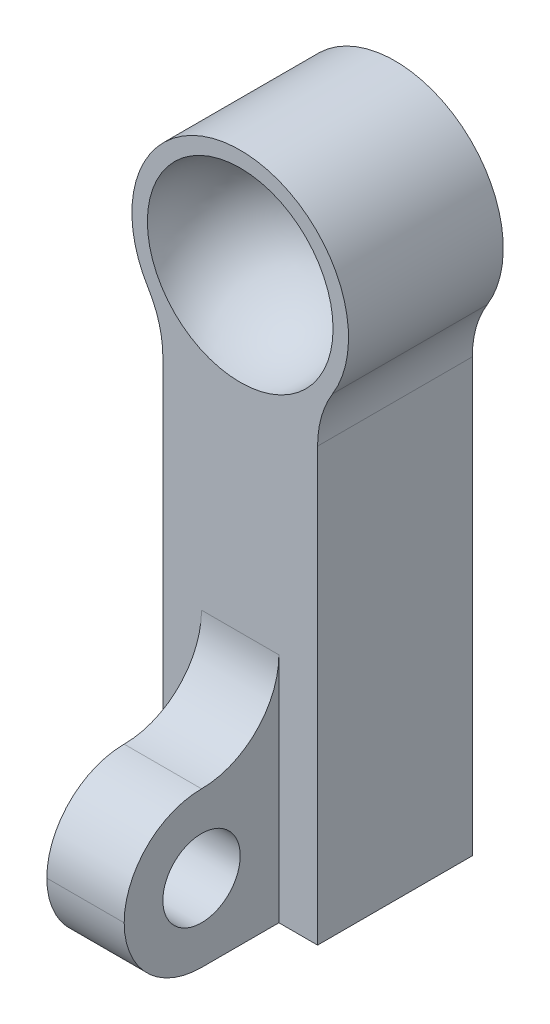
ISO-10303-21;
HEADER;
FILE_DESCRIPTION(('STEP AP214'),'2;1');
FILE_NAME('part.step','',(''),(''),'','','');
FILE_SCHEMA(('AUTOMOTIVE_DESIGN { 1 0 10303 214 1 1 1 1 }'));
ENDSEC;
DATA;
#1=APPLICATION_CONTEXT('core data for automotive mechanical design processes');
#2=APPLICATION_PROTOCOL_DEFINITION('international standard','automotive_design',2000,#1);
#3=PRODUCT_CONTEXT('',#1,'mechanical');
#4=PRODUCT('Part','Part','',(#3));
#5=PRODUCT_RELATED_PRODUCT_CATEGORY('part','',(#4));
#6=PRODUCT_DEFINITION_FORMATION('','',#4);
#7=PRODUCT_DEFINITION_CONTEXT('part definition',#1,'design');
#8=PRODUCT_DEFINITION('design','',#6,#7);
#9=PRODUCT_DEFINITION_SHAPE('','',#8);
#10=(LENGTH_UNIT() NAMED_UNIT(*) SI_UNIT(.MILLI.,.METRE.));
#11=(NAMED_UNIT(*) PLANE_ANGLE_UNIT() SI_UNIT($,.RADIAN.));
#12=(NAMED_UNIT(*) SI_UNIT($,.STERADIAN.) SOLID_ANGLE_UNIT());
#13=UNCERTAINTY_MEASURE_WITH_UNIT(LENGTH_MEASURE(1.E-05),#10,'distance_accuracy_value','');
#14=(GEOMETRIC_REPRESENTATION_CONTEXT(3) GLOBAL_UNCERTAINTY_ASSIGNED_CONTEXT((#13)) GLOBAL_UNIT_ASSIGNED_CONTEXT((#10,
#11,#12)) REPRESENTATION_CONTEXT('',''));
#15=CARTESIAN_POINT('',(0.,0.,0.));
#16=DIRECTION('',(0.,0.,1.));
#17=DIRECTION('',(1.,0.,0.));
#18=AXIS2_PLACEMENT_3D('',#15,#16,#17);
#19=CARTESIAN_POINT('',(5.75,-3.53553390593274,5.));
#20=DIRECTION('',(0.,0.,-1.));
#21=DIRECTION('',(-1.,0.,0.));
#22=AXIS2_PLACEMENT_3D('',#19,#20,#21);
#23=CYLINDRICAL_SURFACE('',#22,3.25);
#24=CARTESIAN_POINT('',(5.75,-3.53553390593274,0.));
#25=DIRECTION('',(0.,0.,-1.));
#26=DIRECTION('',(1.,0.,0.));
#27=AXIS2_PLACEMENT_3D('',#24,#25,#26);
#28=CIRCLE('',#27,3.25);
#29=CARTESIAN_POINT('',(2.5,-3.53553390593274,0.));
#30=VERTEX_POINT('',#29);
#31=CARTESIAN_POINT('',(2.98148148148148,-1.83323980307623,0.));
#32=VERTEX_POINT('',#31);
#33=EDGE_CURVE('E171',#30,#32,#28,.T.);
#34=ORIENTED_EDGE('',*,*,#33,.T.);
#35=DIRECTION('',(0.,0.,-1.));
#36=VECTOR('',#35,1.);
#37=CARTESIAN_POINT('',(2.98148148148148,-1.83323980307623,5.));
#38=LINE('',#37,#36);
#39=CARTESIAN_POINT('',(2.98148148148148,-1.83323980307623,5.));
#40=VERTEX_POINT('',#39);
#41=EDGE_CURVE('E163',#40,#32,#38,.T.);
#42=ORIENTED_EDGE('',*,*,#41,.F.);
#43=CARTESIAN_POINT('',(5.75,-3.53553390593274,5.));
#44=DIRECTION('',(0.,0.,-1.));
#45=DIRECTION('',(1.,0.,0.));
#46=AXIS2_PLACEMENT_3D('',#43,#44,#45);
#47=CIRCLE('',#46,3.25);
#48=CARTESIAN_POINT('',(2.5,-3.53553390593274,5.));
#49=VERTEX_POINT('',#48);
#50=EDGE_CURVE('E151',#49,#40,#47,.T.);
#51=ORIENTED_EDGE('',*,*,#50,.F.);
#52=DIRECTION('',(0.,0.,-1.));
#53=VECTOR('',#52,1.);
#54=CARTESIAN_POINT('',(2.5,-3.53553390593274,5.));
#55=LINE('',#54,#53);
#56=EDGE_CURVE('E191',#49,#30,#55,.T.);
#57=ORIENTED_EDGE('',*,*,#56,.T.);
#58=EDGE_LOOP('',(#34,#42,#51,#57));
#59=FACE_BOUND('',#58,.T.);
#60=ADVANCED_FACE('F38',(#59),#23,.F.);
#61=CARTESIAN_POINT('',(0.,0.,5.));
#62=DIRECTION('',(0.,0.,-1.));
#63=DIRECTION('',(-1.,0.,0.));
#64=AXIS2_PLACEMENT_3D('',#61,#62,#63);
#65=CYLINDRICAL_SURFACE('',#64,3.5);
#66=CARTESIAN_POINT('',(0.,0.,0.));
#67=DIRECTION('',(0.,0.,1.));
#68=DIRECTION('',(1.,0.,0.));
#69=AXIS2_PLACEMENT_3D('',#66,#67,#68);
#70=CIRCLE('',#69,3.5);
#71=CARTESIAN_POINT('',(-2.98148148148148,-1.83323980307624,0.));
#72=VERTEX_POINT('',#71);
#73=EDGE_CURVE('E194',#32,#72,#70,.T.);
#74=ORIENTED_EDGE('',*,*,#73,.T.);
#75=DIRECTION('',(0.,0.,-1.));
#76=VECTOR('',#75,1.);
#77=CARTESIAN_POINT('',(-2.98148148148148,-1.83323980307624,5.));
#78=LINE('',#77,#76);
#79=CARTESIAN_POINT('',(-2.98148148148148,-1.83323980307624,5.));
#80=VERTEX_POINT('',#79);
#81=EDGE_CURVE('E215',#80,#72,#78,.T.);
#82=ORIENTED_EDGE('',*,*,#81,.F.);
#83=CARTESIAN_POINT('',(0.,0.,5.));
#84=DIRECTION('',(0.,0.,1.));
#85=DIRECTION('',(1.,0.,0.));
#86=AXIS2_PLACEMENT_3D('',#83,#84,#85);
#87=CIRCLE('',#86,3.5);
#88=EDGE_CURVE('E222',#40,#80,#87,.T.);
#89=ORIENTED_EDGE('',*,*,#88,.F.);
#90=ORIENTED_EDGE('',*,*,#41,.T.);
#91=EDGE_LOOP('',(#74,#82,#89,#90));
#92=FACE_BOUND('',#91,.T.);
#93=ADVANCED_FACE('F220',(#92),#65,.T.);
#94=CARTESIAN_POINT('',(-5.75,-3.53553390593274,5.));
#95=DIRECTION('',(0.,0.,-1.));
#96=DIRECTION('',(-1.,0.,0.));
#97=AXIS2_PLACEMENT_3D('',#94,#95,#96);
#98=CYLINDRICAL_SURFACE('',#97,3.25);
#99=CARTESIAN_POINT('',(-5.75,-3.53553390593274,0.));
#100=DIRECTION('',(0.,0.,-1.));
#101=DIRECTION('',(1.,0.,0.));
#102=AXIS2_PLACEMENT_3D('',#99,#100,#101);
#103=CIRCLE('',#102,3.25);
#104=CARTESIAN_POINT('',(-2.5,-3.53553390593274,0.));
#105=VERTEX_POINT('',#104);
#106=EDGE_CURVE('E196',#72,#105,#103,.T.);
#107=ORIENTED_EDGE('',*,*,#106,.T.);
#108=DIRECTION('',(0.,0.,-1.));
#109=VECTOR('',#108,1.);
#110=CARTESIAN_POINT('',(-2.5,-3.53553390593274,5.));
#111=LINE('',#110,#109);
#112=CARTESIAN_POINT('',(-2.5,-3.53553390593274,5.));
#113=VERTEX_POINT('',#112);
#114=EDGE_CURVE('E212',#113,#105,#111,.T.);
#115=ORIENTED_EDGE('',*,*,#114,.F.);
#116=CARTESIAN_POINT('',(-5.75,-3.53553390593274,5.));
#117=DIRECTION('',(0.,0.,-1.));
#118=DIRECTION('',(1.,0.,0.));
#119=AXIS2_PLACEMENT_3D('',#116,#117,#118);
#120=CIRCLE('',#119,3.25);
#121=EDGE_CURVE('E245',#80,#113,#120,.T.);
#122=ORIENTED_EDGE('',*,*,#121,.F.);
#123=ORIENTED_EDGE('',*,*,#81,.T.);
#124=EDGE_LOOP('',(#107,#115,#122,#123));
#125=FACE_BOUND('',#124,.T.);
#126=ADVANCED_FACE('F236',(#125),#98,.F.);
#127=CARTESIAN_POINT('',(-2.5,-3.53553390593274,5.));
#128=DIRECTION('',(1.,0.,0.));
#129=DIRECTION('',(0.,1.,0.));
#130=AXIS2_PLACEMENT_3D('',#127,#128,#129);
#131=PLANE('',#130);
#132=DIRECTION('',(0.,-1.,0.));
#133=VECTOR('',#132,1.);
#134=CARTESIAN_POINT('',(-2.5,-3.53553390593274,0.));
#135=LINE('',#134,#133);
#136=CARTESIAN_POINT('',(-2.5,-17.5,0.));
#137=VERTEX_POINT('',#136);
#138=EDGE_CURVE('E198',#105,#137,#135,.T.);
#139=ORIENTED_EDGE('',*,*,#138,.T.);
#140=DIRECTION('',(0.,0.,-1.));
#141=VECTOR('',#140,1.);
#142=CARTESIAN_POINT('',(-2.5,-17.5,5.));
#143=LINE('',#142,#141);
#144=CARTESIAN_POINT('',(-2.5,-17.5,5.));
#145=VERTEX_POINT('',#144);
#146=EDGE_CURVE('E209',#145,#137,#143,.T.);
#147=ORIENTED_EDGE('',*,*,#146,.F.);
#148=DIRECTION('',(0.,-1.,0.));
#149=VECTOR('',#148,1.);
#150=CARTESIAN_POINT('',(-2.5,-3.53553390593274,5.));
#151=LINE('',#150,#149);
#152=EDGE_CURVE('E182',#113,#145,#151,.T.);
#153=ORIENTED_EDGE('',*,*,#152,.F.);
#154=ORIENTED_EDGE('',*,*,#114,.T.);
#155=EDGE_LOOP('',(#139,#147,#153,#154));
#156=FACE_BOUND('',#155,.T.);
#157=ADVANCED_FACE('F240',(#156),#131,.F.);
#158=CARTESIAN_POINT('',(-2.5,-17.5,5.));
#159=DIRECTION('',(0.,1.,0.));
#160=DIRECTION('',(0.,0.,1.));
#161=AXIS2_PLACEMENT_3D('',#158,#159,#160);
#162=PLANE('',#161);
#163=CARTESIAN_POINT('',(0.,-17.5,2.5));
#164=DIRECTION('',(0.,-1.,0.));
#165=DIRECTION('',(0.,0.,-1.));
#166=AXIS2_PLACEMENT_3D('',#163,#164,#165);
#167=CIRCLE('',#166,1.25);
#168=CARTESIAN_POINT('',(0.,-17.5,1.25));
#169=VERTEX_POINT('',#168);
#170=EDGE_CURVE('E135',#169,#169,#167,.T.);
#171=ORIENTED_EDGE('',*,*,#170,.F.);
#172=EDGE_LOOP('',(#171));
#173=FACE_BOUND('',#172,.T.);
#174=DIRECTION('',(0.,0.,-1.));
#175=VECTOR('',#174,1.);
#176=CARTESIAN_POINT('',(1.25,-17.5,5.));
#177=LINE('',#176,#175);
#178=CARTESIAN_POINT('',(1.25,-17.5,7.5));
#179=VERTEX_POINT('',#178);
#180=CARTESIAN_POINT('',(1.25,-17.5,5.));
#181=VERTEX_POINT('',#180);
#182=EDGE_CURVE('E155',#179,#181,#177,.T.);
#183=ORIENTED_EDGE('',*,*,#182,.F.);
#184=DIRECTION('',(1.,0.,0.));
#185=VECTOR('',#184,1.);
#186=CARTESIAN_POINT('',(-1.25,-17.5,7.5));
#187=LINE('',#186,#185);
#188=CARTESIAN_POINT('',(-1.25,-17.5,7.5));
#189=VERTEX_POINT('',#188);
#190=EDGE_CURVE('E267',#179,#189,#187,.F.);
#191=ORIENTED_EDGE('',*,*,#190,.T.);
#192=DIRECTION('',(0.,0.,-1.));
#193=VECTOR('',#192,1.);
#194=CARTESIAN_POINT('',(-1.25,-17.5,5.));
#195=LINE('',#194,#193);
#196=CARTESIAN_POINT('',(-1.25,-17.5,5.));
#197=VERTEX_POINT('',#196);
#198=EDGE_CURVE('E169',#189,#197,#195,.T.);
#199=ORIENTED_EDGE('',*,*,#198,.T.);
#200=DIRECTION('',(1.,0.,0.));
#201=VECTOR('',#200,1.);
#202=CARTESIAN_POINT('',(-2.5,-17.5,5.));
#203=LINE('',#202,#201);
#204=EDGE_CURVE('E181',#145,#197,#203,.T.);
#205=ORIENTED_EDGE('',*,*,#204,.F.);
#206=ORIENTED_EDGE('',*,*,#146,.T.);
#207=DIRECTION('',(1.,0.,0.));
#208=VECTOR('',#207,1.);
#209=CARTESIAN_POINT('',(-2.5,-17.5,0.));
#210=LINE('',#209,#208);
#211=CARTESIAN_POINT('',(2.5,-17.5,0.));
#212=VERTEX_POINT('',#211);
#213=EDGE_CURVE('E200',#137,#212,#210,.T.);
#214=ORIENTED_EDGE('',*,*,#213,.T.);
#215=DIRECTION('',(0.,0.,-1.));
#216=VECTOR('',#215,1.);
#217=CARTESIAN_POINT('',(2.5,-17.5,5.));
#218=LINE('',#217,#216);
#219=CARTESIAN_POINT('',(2.5,-17.5,5.));
#220=VERTEX_POINT('',#219);
#221=EDGE_CURVE('E206',#220,#212,#218,.T.);
#222=ORIENTED_EDGE('',*,*,#221,.F.);
#223=EDGE_CURVE('E178',#181,#220,#203,.T.);
#224=ORIENTED_EDGE('',*,*,#223,.F.);
#225=EDGE_LOOP('',(#183,#191,#199,#205,#206,#214,#222,#224));
#226=FACE_BOUND('',#225,.T.);
#227=ADVANCED_FACE('F255',(#173,#226),#162,.F.);
#228=CARTESIAN_POINT('',(2.5,-3.53553390593274,5.));
#229=DIRECTION('',(-1.,0.,0.));
#230=DIRECTION('',(0.,-1.,0.));
#231=AXIS2_PLACEMENT_3D('',#228,#229,#230);
#232=PLANE('',#231);
#233=DIRECTION('',(0.,1.,0.));
#234=VECTOR('',#233,1.);
#235=CARTESIAN_POINT('',(2.5,-3.53553390593274,0.));
#236=LINE('',#235,#234);
#237=EDGE_CURVE('E202',#212,#30,#236,.T.);
#238=ORIENTED_EDGE('',*,*,#237,.T.);
#239=ORIENTED_EDGE('',*,*,#56,.F.);
#240=DIRECTION('',(0.,1.,0.));
#241=VECTOR('',#240,1.);
#242=CARTESIAN_POINT('',(2.5,-3.53553390593274,5.));
#243=LINE('',#242,#241);
#244=EDGE_CURVE('E188',#220,#49,#243,.T.);
#245=ORIENTED_EDGE('',*,*,#244,.F.);
#246=ORIENTED_EDGE('',*,*,#221,.T.);
#247=EDGE_LOOP('',(#238,#239,#245,#246));
#248=FACE_BOUND('',#247,.T.);
#249=ADVANCED_FACE('F252',(#248),#232,.F.);
#250=CARTESIAN_POINT('',(5.75,-3.53553390593274,5.));
#251=DIRECTION('',(0.,0.,1.));
#252=DIRECTION('',(1.,0.,0.));
#253=AXIS2_PLACEMENT_3D('',#250,#251,#252);
#254=PLANE('',#253);
#255=CARTESIAN_POINT('',(0.,0.,5.));
#256=DIRECTION('',(0.,0.,1.));
#257=DIRECTION('',(1.,0.,0.));
#258=AXIS2_PLACEMENT_3D('',#255,#256,#257);
#259=CIRCLE('',#258,3.);
#260=CARTESIAN_POINT('',(3.,0.,5.));
#261=VERTEX_POINT('',#260);
#262=EDGE_CURVE('E134',#261,#261,#259,.T.);
#263=ORIENTED_EDGE('',*,*,#262,.F.);
#264=EDGE_LOOP('',(#263));
#265=FACE_BOUND('',#264,.T.);
#266=DIRECTION('',(1.,0.,0.));
#267=VECTOR('',#266,1.);
#268=CARTESIAN_POINT('',(1.25,-10.,5.));
#269=LINE('',#268,#267);
#270=CARTESIAN_POINT('',(-1.25,-10.,5.));
#271=VERTEX_POINT('',#270);
#272=CARTESIAN_POINT('',(1.25,-10.,5.));
#273=VERTEX_POINT('',#272);
#274=EDGE_CURVE('E159',#271,#273,#269,.T.);
#275=ORIENTED_EDGE('',*,*,#274,.T.);
#276=DIRECTION('',(0.,1.,0.));
#277=VECTOR('',#276,1.);
#278=CARTESIAN_POINT('',(1.25,-17.5,5.));
#279=LINE('',#278,#277);
#280=EDGE_CURVE('E148',#181,#273,#279,.T.);
#281=ORIENTED_EDGE('',*,*,#280,.F.);
#282=ORIENTED_EDGE('',*,*,#223,.T.);
#283=ORIENTED_EDGE('',*,*,#244,.T.);
#284=ORIENTED_EDGE('',*,*,#50,.T.);
#285=ORIENTED_EDGE('',*,*,#88,.T.);
#286=ORIENTED_EDGE('',*,*,#121,.T.);
#287=ORIENTED_EDGE('',*,*,#152,.T.);
#288=ORIENTED_EDGE('',*,*,#204,.T.);
#289=DIRECTION('',(0.,1.,0.));
#290=VECTOR('',#289,1.);
#291=CARTESIAN_POINT('',(-1.25,-17.5,5.));
#292=LINE('',#291,#290);
#293=EDGE_CURVE('E165',#197,#271,#292,.T.);
#294=ORIENTED_EDGE('',*,*,#293,.T.);
#295=EDGE_LOOP('',(#275,#281,#282,#283,#284,#285,#286,#287,#288,#294));
#296=FACE_BOUND('',#295,.T.);
#297=ADVANCED_FACE('F246',(#265,#296),#254,.T.);
#298=CARTESIAN_POINT('',(5.75,-3.53553390593274,0.));
#299=DIRECTION('',(0.,0.,1.));
#300=DIRECTION('',(1.,0.,0.));
#301=AXIS2_PLACEMENT_3D('',#298,#299,#300);
#302=PLANE('',#301);
#303=ORIENTED_EDGE('',*,*,#33,.F.);
#304=ORIENTED_EDGE('',*,*,#237,.F.);
#305=ORIENTED_EDGE('',*,*,#213,.F.);
#306=ORIENTED_EDGE('',*,*,#138,.F.);
#307=ORIENTED_EDGE('',*,*,#106,.F.);
#308=ORIENTED_EDGE('',*,*,#73,.F.);
#309=EDGE_LOOP('',(#303,#304,#305,#306,#307,#308));
#310=FACE_BOUND('',#309,.T.);
#311=ADVANCED_FACE('F230',(#310),#302,.F.);
#312=CARTESIAN_POINT('',(-1.25,0.,0.));
#313=DIRECTION('',(1.,0.,0.));
#314=DIRECTION('',(0.,0.,-1.));
#315=AXIS2_PLACEMENT_3D('',#312,#313,#314);
#316=PLANE('',#315);
#317=CARTESIAN_POINT('',(-1.25,-15.,7.5));
#318=DIRECTION('',(1.,0.,0.));
#319=DIRECTION('',(0.,0.,-1.));
#320=AXIS2_PLACEMENT_3D('',#317,#318,#319);
#321=CIRCLE('',#320,1.25);
#322=CARTESIAN_POINT('',(-1.25,-15.,6.25));
#323=VERTEX_POINT('',#322);
#324=EDGE_CURVE('E145',#323,#323,#321,.T.);
#325=ORIENTED_EDGE('',*,*,#324,.T.);
#326=EDGE_LOOP('',(#325));
#327=FACE_BOUND('',#326,.T.);
#328=CARTESIAN_POINT('',(-1.25,-15.,7.5));
#329=DIRECTION('',(1.,0.,0.));
#330=DIRECTION('',(0.,0.,-1.));
#331=AXIS2_PLACEMENT_3D('',#328,#329,#330);
#332=CIRCLE('',#331,2.5);
#333=CARTESIAN_POINT('',(-1.25,-15.,10.));
#334=VERTEX_POINT('',#333);
#335=EDGE_CURVE('E59',#189,#334,#332,.F.);
#336=ORIENTED_EDGE('',*,*,#335,.T.);
#337=CARTESIAN_POINT('',(-1.25,-15.,7.5));
#338=DIRECTION('',(1.,0.,0.));
#339=DIRECTION('',(0.,0.,-1.));
#340=AXIS2_PLACEMENT_3D('',#337,#338,#339);
#341=CIRCLE('',#340,2.5);
#342=CARTESIAN_POINT('',(-1.25,-12.5,7.5));
#343=VERTEX_POINT('',#342);
#344=EDGE_CURVE('E54',#334,#343,#341,.F.);
#345=ORIENTED_EDGE('',*,*,#344,.T.);
#346=CARTESIAN_POINT('',(-1.25,-10.,7.5));
#347=DIRECTION('',(1.,0.,0.));
#348=DIRECTION('',(0.,0.,-1.));
#349=AXIS2_PLACEMENT_3D('',#346,#347,#348);
#350=CIRCLE('',#349,2.5);
#351=EDGE_CURVE('E11',#343,#271,#350,.T.);
#352=ORIENTED_EDGE('',*,*,#351,.T.);
#353=ORIENTED_EDGE('',*,*,#293,.F.);
#354=ORIENTED_EDGE('',*,*,#198,.F.);
#355=EDGE_LOOP('',(#336,#345,#352,#353,#354));
#356=FACE_BOUND('',#355,.T.);
#357=ADVANCED_FACE('F259',(#327,#356),#316,.F.);
#358=CARTESIAN_POINT('',(1.25,0.,0.));
#359=DIRECTION('',(1.,0.,0.));
#360=DIRECTION('',(0.,0.,-1.));
#361=AXIS2_PLACEMENT_3D('',#358,#359,#360);
#362=PLANE('',#361);
#363=CARTESIAN_POINT('',(1.25,-15.,7.5));
#364=DIRECTION('',(1.,0.,0.));
#365=DIRECTION('',(0.,0.,-1.));
#366=AXIS2_PLACEMENT_3D('',#363,#364,#365);
#367=CIRCLE('',#366,1.25);
#368=CARTESIAN_POINT('',(1.25,-15.,6.25));
#369=VERTEX_POINT('',#368);
#370=EDGE_CURVE('E138',#369,#369,#367,.T.);
#371=ORIENTED_EDGE('',*,*,#370,.F.);
#372=EDGE_LOOP('',(#371));
#373=FACE_BOUND('',#372,.T.);
#374=ORIENTED_EDGE('',*,*,#280,.T.);
#375=CARTESIAN_POINT('',(1.25,-10.,7.5));
#376=DIRECTION('',(1.,0.,0.));
#377=DIRECTION('',(0.,0.,-1.));
#378=AXIS2_PLACEMENT_3D('',#375,#376,#377);
#379=CIRCLE('',#378,2.5);
#380=CARTESIAN_POINT('',(1.25,-12.5,7.5));
#381=VERTEX_POINT('',#380);
#382=EDGE_CURVE('E47',#273,#381,#379,.F.);
#383=ORIENTED_EDGE('',*,*,#382,.T.);
#384=CARTESIAN_POINT('',(1.25,-15.,7.5));
#385=DIRECTION('',(1.,0.,0.));
#386=DIRECTION('',(0.,0.,-1.));
#387=AXIS2_PLACEMENT_3D('',#384,#385,#386);
#388=CIRCLE('',#387,2.5);
#389=CARTESIAN_POINT('',(1.25,-15.,10.));
#390=VERTEX_POINT('',#389);
#391=EDGE_CURVE('E167',#381,#390,#388,.T.);
#392=ORIENTED_EDGE('',*,*,#391,.T.);
#393=CARTESIAN_POINT('',(1.25,-15.,7.5));
#394=DIRECTION('',(1.,0.,0.));
#395=DIRECTION('',(0.,0.,-1.));
#396=AXIS2_PLACEMENT_3D('',#393,#394,#395);
#397=CIRCLE('',#396,2.5);
#398=EDGE_CURVE('E162',#390,#179,#397,.T.);
#399=ORIENTED_EDGE('',*,*,#398,.T.);
#400=ORIENTED_EDGE('',*,*,#182,.T.);
#401=EDGE_LOOP('',(#374,#383,#392,#399,#400));
#402=FACE_BOUND('',#401,.T.);
#403=ADVANCED_FACE('F276',(#373,#402),#362,.T.);
#404=CARTESIAN_POINT('',(-2.,-15.,7.5));
#405=DIRECTION('',(1.,0.,0.));
#406=DIRECTION('',(0.,0.,-1.));
#407=AXIS2_PLACEMENT_3D('',#404,#405,#406);
#408=CYLINDRICAL_SURFACE('',#407,1.25);
#409=ORIENTED_EDGE('',*,*,#370,.T.);
#410=EDGE_LOOP('',(#409));
#411=FACE_BOUND('',#410,.T.);
#412=ORIENTED_EDGE('',*,*,#324,.F.);
#413=EDGE_LOOP('',(#412));
#414=FACE_BOUND('',#413,.T.);
#415=ADVANCED_FACE('F278',(#411,#414),#408,.F.);
#416=CARTESIAN_POINT('',(0.,0.,5.));
#417=DIRECTION('',(1.,0.,0.));
#418=DIRECTION('',(0.,0.,1.));
#419=AXIS2_PLACEMENT_3D('',#416,#417,#418);
#420=SPHERICAL_SURFACE('',#419,3.);
#421=CARTESIAN_POINT('',(0.,0.,5.));
#422=DIRECTION('',(0.,0.,1.));
#423=DIRECTION('',(1.,0.,0.));
#424=AXIS2_PLACEMENT_3D('',#421,#422,#423);
#425=SPHERICAL_SURFACE('',#424,3.);
#426=ORIENTED_EDGE('',*,*,#262,.T.);
#427=EDGE_LOOP('',(#426));
#428=FACE_BOUND('',#427,.T.);
#429=ADVANCED_FACE('F128',(#428),#425,.F.);
#430=CARTESIAN_POINT('',(0.,-9.,2.5));
#431=DIRECTION('',(0.,-1.,0.));
#432=DIRECTION('',(0.,0.,-1.));
#433=AXIS2_PLACEMENT_3D('',#430,#431,#432);
#434=CONICAL_SURFACE('',#433,1.25,1.02974425867665);
#435=CARTESIAN_POINT('',(0.,-8.24892422621555,2.5));
#436=VERTEX_POINT('',#435);
#437=VERTEX_LOOP('',#436);
#438=FACE_BOUND('',#437,.T.);
#439=CARTESIAN_POINT('',(0.,-9.,2.5));
#440=DIRECTION('',(0.,-1.,0.));
#441=DIRECTION('',(0.,0.,-1.));
#442=AXIS2_PLACEMENT_3D('',#439,#440,#441);
#443=CIRCLE('',#442,1.25);
#444=CARTESIAN_POINT('',(0.,-9.,1.25));
#445=VERTEX_POINT('',#444);
#446=EDGE_CURVE('E132',#445,#445,#443,.T.);
#447=ORIENTED_EDGE('',*,*,#446,.T.);
#448=EDGE_LOOP('',(#447));
#449=FACE_BOUND('',#448,.T.);
#450=ADVANCED_FACE('F124',(#438,#449),#434,.F.);
#451=CARTESIAN_POINT('',(0.,-17.5,2.5));
#452=DIRECTION('',(0.,-1.,0.));
#453=DIRECTION('',(0.,0.,-1.));
#454=AXIS2_PLACEMENT_3D('',#451,#452,#453);
#455=CYLINDRICAL_SURFACE('',#454,1.25);
#456=ORIENTED_EDGE('',*,*,#446,.F.);
#457=EDGE_LOOP('',(#456));
#458=FACE_BOUND('',#457,.T.);
#459=ORIENTED_EDGE('',*,*,#170,.T.);
#460=EDGE_LOOP('',(#459));
#461=FACE_BOUND('',#460,.T.);
#462=ADVANCED_FACE('F127',(#458,#461),#455,.F.);
#463=CARTESIAN_POINT('',(-1.25,-15.,7.5));
#464=DIRECTION('',(-1.,0.,0.));
#465=DIRECTION('',(0.,0.,1.));
#466=AXIS2_PLACEMENT_3D('',#463,#464,#465);
#467=CYLINDRICAL_SURFACE('',#466,2.5);
#468=ORIENTED_EDGE('',*,*,#190,.F.);
#469=ORIENTED_EDGE('',*,*,#398,.F.);
#470=DIRECTION('',(1.,0.,0.));
#471=VECTOR('',#470,1.);
#472=CARTESIAN_POINT('',(1.25,-15.,10.));
#473=LINE('',#472,#471);
#474=EDGE_CURVE('E42',#334,#390,#473,.T.);
#475=ORIENTED_EDGE('',*,*,#474,.F.);
#476=ORIENTED_EDGE('',*,*,#335,.F.);
#477=EDGE_LOOP('',(#468,#469,#475,#476));
#478=FACE_BOUND('',#477,.T.);
#479=ADVANCED_FACE('F40',(#478),#467,.T.);
#480=CARTESIAN_POINT('',(-1.25,-15.,7.5));
#481=DIRECTION('',(1.,0.,0.));
#482=DIRECTION('',(0.,0.,-1.));
#483=AXIS2_PLACEMENT_3D('',#480,#481,#482);
#484=CYLINDRICAL_SURFACE('',#483,2.5);
#485=DIRECTION('',(1.,0.,0.));
#486=VECTOR('',#485,1.);
#487=CARTESIAN_POINT('',(-1.25,-12.5,7.5));
#488=LINE('',#487,#486);
#489=EDGE_CURVE('E264',#343,#381,#488,.T.);
#490=ORIENTED_EDGE('',*,*,#489,.F.);
#491=ORIENTED_EDGE('',*,*,#344,.F.);
#492=ORIENTED_EDGE('',*,*,#474,.T.);
#493=ORIENTED_EDGE('',*,*,#391,.F.);
#494=EDGE_LOOP('',(#490,#491,#492,#493));
#495=FACE_BOUND('',#494,.T.);
#496=ADVANCED_FACE('F272',(#495),#484,.T.);
#497=CARTESIAN_POINT('',(5.75,-10.,7.5));
#498=DIRECTION('',(-1.,0.,0.));
#499=DIRECTION('',(0.,0.,1.));
#500=AXIS2_PLACEMENT_3D('',#497,#498,#499);
#501=CYLINDRICAL_SURFACE('',#500,2.5);
#502=ORIENTED_EDGE('',*,*,#351,.F.);
#503=ORIENTED_EDGE('',*,*,#489,.T.);
#504=ORIENTED_EDGE('',*,*,#382,.F.);
#505=ORIENTED_EDGE('',*,*,#274,.F.);
#506=EDGE_LOOP('',(#502,#503,#504,#505));
#507=FACE_BOUND('',#506,.T.);
#508=ADVANCED_FACE('F263',(#507),#501,.F.);
#509=CLOSED_SHELL('',(#60,#93,#126,#157,#227,#249,#297,#311,#357,#403,#415,#429,#450,#462,#479,
#496,#508));
#510=MANIFOLD_SOLID_BREP('B2',#509);
#511=ADVANCED_BREP_SHAPE_REPRESENTATION('',(#18,#510),#14);
#512=SHAPE_DEFINITION_REPRESENTATION(#9,#511);
ENDSEC;
END-ISO-10303-21;
